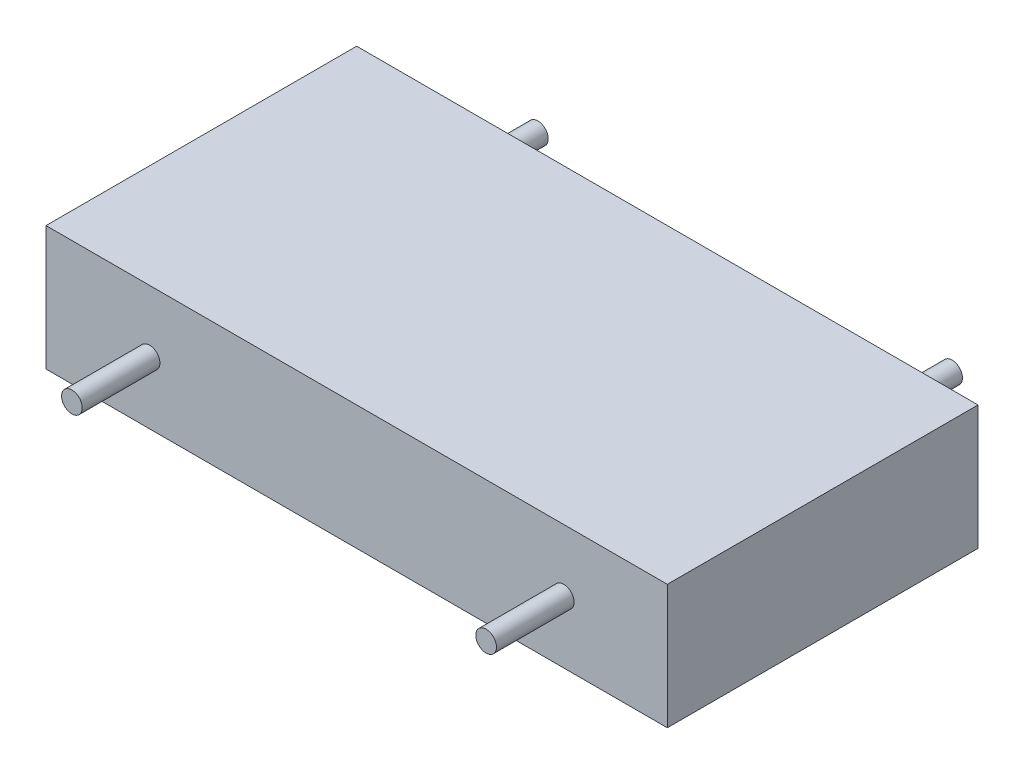
ISO-10303-21;
HEADER;
FILE_DESCRIPTION(('STEP AP214'),'2;1');
FILE_NAME('part.step','',(''),(''),'','','');
FILE_SCHEMA(('AUTOMOTIVE_DESIGN { 1 0 10303 214 1 1 1 1 }'));
ENDSEC;
DATA;
#1=APPLICATION_CONTEXT('core data for automotive mechanical design processes');
#2=APPLICATION_PROTOCOL_DEFINITION('international standard','automotive_design',2000,#1);
#3=PRODUCT_CONTEXT('',#1,'mechanical');
#4=PRODUCT('Part','Part','',(#3));
#5=PRODUCT_RELATED_PRODUCT_CATEGORY('part','',(#4));
#6=PRODUCT_DEFINITION_FORMATION('','',#4);
#7=PRODUCT_DEFINITION_CONTEXT('part definition',#1,'design');
#8=PRODUCT_DEFINITION('design','',#6,#7);
#9=PRODUCT_DEFINITION_SHAPE('','',#8);
#10=(LENGTH_UNIT() NAMED_UNIT(*) SI_UNIT(.MILLI.,.METRE.));
#11=(NAMED_UNIT(*) PLANE_ANGLE_UNIT() SI_UNIT($,.RADIAN.));
#12=(NAMED_UNIT(*) SI_UNIT($,.STERADIAN.) SOLID_ANGLE_UNIT());
#13=UNCERTAINTY_MEASURE_WITH_UNIT(LENGTH_MEASURE(1.E-05),#10,'distance_accuracy_value','');
#14=(GEOMETRIC_REPRESENTATION_CONTEXT(3) GLOBAL_UNCERTAINTY_ASSIGNED_CONTEXT((#13)) GLOBAL_UNIT_ASSIGNED_CONTEXT((#10,
#11,#12)) REPRESENTATION_CONTEXT('',''));
#15=CARTESIAN_POINT('',(0.,0.,0.));
#16=DIRECTION('',(0.,0.,1.));
#17=DIRECTION('',(1.,0.,0.));
#18=AXIS2_PLACEMENT_3D('',#15,#16,#17);
#19=CARTESIAN_POINT('',(300.,120.,150.));
#20=DIRECTION('',(-1.,0.,0.));
#21=DIRECTION('',(0.,0.,1.));
#22=AXIS2_PLACEMENT_3D('',#19,#20,#21);
#23=PLANE('',#22);
#24=DIRECTION('',(0.,0.,-1.));
#25=VECTOR('',#24,1.);
#26=CARTESIAN_POINT('',(300.,0.,150.));
#27=LINE('',#26,#25);
#28=CARTESIAN_POINT('',(300.,0.,150.));
#29=VERTEX_POINT('',#28);
#30=CARTESIAN_POINT('',(300.,0.,-150.));
#31=VERTEX_POINT('',#30);
#32=EDGE_CURVE('E117',#29,#31,#27,.T.);
#33=ORIENTED_EDGE('',*,*,#32,.T.);
#34=DIRECTION('',(0.,-1.,0.));
#35=VECTOR('',#34,1.);
#36=CARTESIAN_POINT('',(300.,120.,-150.));
#37=LINE('',#36,#35);
#38=CARTESIAN_POINT('',(300.,120.,-150.));
#39=VERTEX_POINT('',#38);
#40=EDGE_CURVE('E106',#39,#31,#37,.T.);
#41=ORIENTED_EDGE('',*,*,#40,.F.);
#42=DIRECTION('',(0.,0.,-1.));
#43=VECTOR('',#42,1.);
#44=CARTESIAN_POINT('',(300.,120.,150.));
#45=LINE('',#44,#43);
#46=CARTESIAN_POINT('',(300.,120.,150.));
#47=VERTEX_POINT('',#46);
#48=EDGE_CURVE('E98',#47,#39,#45,.T.);
#49=ORIENTED_EDGE('',*,*,#48,.F.);
#50=DIRECTION('',(0.,-1.,0.));
#51=VECTOR('',#50,1.);
#52=CARTESIAN_POINT('',(300.,120.,150.));
#53=LINE('',#52,#51);
#54=EDGE_CURVE('E113',#47,#29,#53,.T.);
#55=ORIENTED_EDGE('',*,*,#54,.T.);
#56=EDGE_LOOP('',(#33,#41,#49,#55));
#57=FACE_BOUND('',#56,.T.);
#58=ADVANCED_FACE('F45',(#57),#23,.F.);
#59=CARTESIAN_POINT('',(-300.,120.,-150.));
#60=DIRECTION('',(0.,0.,1.));
#61=DIRECTION('',(1.,0.,0.));
#62=AXIS2_PLACEMENT_3D('',#59,#60,#61);
#63=PLANE('',#62);
#64=CARTESIAN_POINT('',(-200.,60.,-150.));
#65=DIRECTION('',(0.,0.,1.));
#66=DIRECTION('',(1.,0.,0.));
#67=AXIS2_PLACEMENT_3D('',#64,#65,#66);
#68=CIRCLE('',#67,9.99999999999998);
#69=CARTESIAN_POINT('',(-190.,60.,-150.));
#70=VERTEX_POINT('',#69);
#71=EDGE_CURVE('E11',#70,#70,#68,.F.);
#72=ORIENTED_EDGE('',*,*,#71,.F.);
#73=EDGE_LOOP('',(#72));
#74=FACE_BOUND('',#73,.T.);
#75=CARTESIAN_POINT('',(200.,60.,-150.));
#76=DIRECTION('',(0.,0.,1.));
#77=DIRECTION('',(1.,0.,0.));
#78=AXIS2_PLACEMENT_3D('',#75,#76,#77);
#79=CIRCLE('',#78,10.);
#80=CARTESIAN_POINT('',(210.,60.,-150.));
#81=VERTEX_POINT('',#80);
#82=EDGE_CURVE('E54',#81,#81,#79,.F.);
#83=ORIENTED_EDGE('',*,*,#82,.F.);
#84=EDGE_LOOP('',(#83));
#85=FACE_BOUND('',#84,.T.);
#86=DIRECTION('',(-1.,0.,0.));
#87=VECTOR('',#86,1.);
#88=CARTESIAN_POINT('',(-300.,0.,-150.));
#89=LINE('',#88,#87);
#90=CARTESIAN_POINT('',(-300.,0.,-150.));
#91=VERTEX_POINT('',#90);
#92=EDGE_CURVE('E104',#31,#91,#89,.T.);
#93=ORIENTED_EDGE('',*,*,#92,.T.);
#94=DIRECTION('',(0.,-1.,0.));
#95=VECTOR('',#94,1.);
#96=CARTESIAN_POINT('',(-300.,120.,-150.));
#97=LINE('',#96,#95);
#98=CARTESIAN_POINT('',(-300.,120.,-150.));
#99=VERTEX_POINT('',#98);
#100=EDGE_CURVE('E102',#99,#91,#97,.T.);
#101=ORIENTED_EDGE('',*,*,#100,.F.);
#102=DIRECTION('',(-1.,0.,0.));
#103=VECTOR('',#102,1.);
#104=CARTESIAN_POINT('',(-300.,120.,-150.));
#105=LINE('',#104,#103);
#106=EDGE_CURVE('E93',#39,#99,#105,.T.);
#107=ORIENTED_EDGE('',*,*,#106,.F.);
#108=ORIENTED_EDGE('',*,*,#40,.T.);
#109=EDGE_LOOP('',(#93,#101,#107,#108));
#110=FACE_BOUND('',#109,.T.);
#111=ADVANCED_FACE('F103',(#74,#85,#110),#63,.F.);
#112=CARTESIAN_POINT('',(-300.,120.,150.));
#113=DIRECTION('',(1.,0.,0.));
#114=DIRECTION('',(0.,0.,-1.));
#115=AXIS2_PLACEMENT_3D('',#112,#113,#114);
#116=PLANE('',#115);
#117=DIRECTION('',(0.,0.,1.));
#118=VECTOR('',#117,1.);
#119=CARTESIAN_POINT('',(-300.,0.,150.));
#120=LINE('',#119,#118);
#121=CARTESIAN_POINT('',(-300.,0.,150.));
#122=VERTEX_POINT('',#121);
#123=EDGE_CURVE('E79',#91,#122,#120,.T.);
#124=ORIENTED_EDGE('',*,*,#123,.T.);
#125=DIRECTION('',(0.,-1.,0.));
#126=VECTOR('',#125,1.);
#127=CARTESIAN_POINT('',(-300.,120.,150.));
#128=LINE('',#127,#126);
#129=CARTESIAN_POINT('',(-300.,120.,150.));
#130=VERTEX_POINT('',#129);
#131=EDGE_CURVE('E107',#130,#122,#128,.T.);
#132=ORIENTED_EDGE('',*,*,#131,.F.);
#133=DIRECTION('',(0.,0.,1.));
#134=VECTOR('',#133,1.);
#135=CARTESIAN_POINT('',(-300.,120.,150.));
#136=LINE('',#135,#134);
#137=EDGE_CURVE('E96',#99,#130,#136,.T.);
#138=ORIENTED_EDGE('',*,*,#137,.F.);
#139=ORIENTED_EDGE('',*,*,#100,.T.);
#140=EDGE_LOOP('',(#124,#132,#138,#139));
#141=FACE_BOUND('',#140,.T.);
#142=ADVANCED_FACE('F109',(#141),#116,.F.);
#143=CARTESIAN_POINT('',(-300.,120.,150.));
#144=DIRECTION('',(0.,0.,-1.));
#145=DIRECTION('',(-1.,0.,0.));
#146=AXIS2_PLACEMENT_3D('',#143,#144,#145);
#147=PLANE('',#146);
#148=CARTESIAN_POINT('',(-200.,60.,150.));
#149=DIRECTION('',(0.,0.,-1.));
#150=DIRECTION('',(-1.,0.,0.));
#151=AXIS2_PLACEMENT_3D('',#148,#149,#150);
#152=CIRCLE('',#151,9.99999999999998);
#153=CARTESIAN_POINT('',(-210.,60.,150.));
#154=VERTEX_POINT('',#153);
#155=EDGE_CURVE('E138',#154,#154,#152,.F.);
#156=ORIENTED_EDGE('',*,*,#155,.F.);
#157=EDGE_LOOP('',(#156));
#158=FACE_BOUND('',#157,.T.);
#159=CARTESIAN_POINT('',(200.,60.,150.));
#160=DIRECTION('',(0.,0.,-1.));
#161=DIRECTION('',(-1.,0.,0.));
#162=AXIS2_PLACEMENT_3D('',#159,#160,#161);
#163=CIRCLE('',#162,10.);
#164=CARTESIAN_POINT('',(190.,60.,150.));
#165=VERTEX_POINT('',#164);
#166=EDGE_CURVE('E134',#165,#165,#163,.F.);
#167=ORIENTED_EDGE('',*,*,#166,.F.);
#168=EDGE_LOOP('',(#167));
#169=FACE_BOUND('',#168,.T.);
#170=DIRECTION('',(1.,0.,0.));
#171=VECTOR('',#170,1.);
#172=CARTESIAN_POINT('',(-300.,0.,150.));
#173=LINE('',#172,#171);
#174=EDGE_CURVE('E85',#122,#29,#173,.T.);
#175=ORIENTED_EDGE('',*,*,#174,.T.);
#176=ORIENTED_EDGE('',*,*,#54,.F.);
#177=DIRECTION('',(1.,0.,0.));
#178=VECTOR('',#177,1.);
#179=CARTESIAN_POINT('',(-300.,120.,150.));
#180=LINE('',#179,#178);
#181=EDGE_CURVE('E62',#130,#47,#180,.T.);
#182=ORIENTED_EDGE('',*,*,#181,.F.);
#183=ORIENTED_EDGE('',*,*,#131,.T.);
#184=EDGE_LOOP('',(#175,#176,#182,#183));
#185=FACE_BOUND('',#184,.T.);
#186=ADVANCED_FACE('F153',(#158,#169,#185),#147,.F.);
#187=CARTESIAN_POINT('',(0.,120.,0.));
#188=DIRECTION('',(0.,-1.,0.));
#189=DIRECTION('',(0.,0.,-1.));
#190=AXIS2_PLACEMENT_3D('',#187,#188,#189);
#191=PLANE('',#190);
#192=ORIENTED_EDGE('',*,*,#48,.T.);
#193=ORIENTED_EDGE('',*,*,#106,.T.);
#194=ORIENTED_EDGE('',*,*,#137,.T.);
#195=ORIENTED_EDGE('',*,*,#181,.T.);
#196=EDGE_LOOP('',(#192,#193,#194,#195));
#197=FACE_BOUND('',#196,.T.);
#198=ADVANCED_FACE('F94',(#197),#191,.F.);
#199=CARTESIAN_POINT('',(0.,0.,0.));
#200=DIRECTION('',(0.,-1.,0.));
#201=DIRECTION('',(0.,0.,-1.));
#202=AXIS2_PLACEMENT_3D('',#199,#200,#201);
#203=PLANE('',#202);
#204=ORIENTED_EDGE('',*,*,#32,.F.);
#205=ORIENTED_EDGE('',*,*,#174,.F.);
#206=ORIENTED_EDGE('',*,*,#123,.F.);
#207=ORIENTED_EDGE('',*,*,#92,.F.);
#208=EDGE_LOOP('',(#204,#205,#206,#207));
#209=FACE_BOUND('',#208,.T.);
#210=ADVANCED_FACE('F161',(#209),#203,.T.);
#211=CARTESIAN_POINT('',(200.,60.,225.));
#212=DIRECTION('',(0.,0.,-1.));
#213=DIRECTION('',(-1.,0.,0.));
#214=AXIS2_PLACEMENT_3D('',#211,#212,#213);
#215=CYLINDRICAL_SURFACE('',#214,10.);
#216=CARTESIAN_POINT('',(200.,60.,225.));
#217=DIRECTION('',(0.,0.,1.));
#218=DIRECTION('',(1.,0.,0.));
#219=AXIS2_PLACEMENT_3D('',#216,#217,#218);
#220=CIRCLE('',#219,10.);
#221=CARTESIAN_POINT('',(210.,60.,225.));
#222=VERTEX_POINT('',#221);
#223=EDGE_CURVE('E121',#222,#222,#220,.T.);
#224=ORIENTED_EDGE('',*,*,#223,.F.);
#225=EDGE_LOOP('',(#224));
#226=FACE_BOUND('',#225,.T.);
#227=ORIENTED_EDGE('',*,*,#166,.T.);
#228=EDGE_LOOP('',(#227));
#229=FACE_BOUND('',#228,.T.);
#230=ADVANCED_FACE('F164',(#226,#229),#215,.T.);
#231=CARTESIAN_POINT('',(200.,60.,225.));
#232=DIRECTION('',(0.,0.,1.));
#233=DIRECTION('',(1.,0.,0.));
#234=AXIS2_PLACEMENT_3D('',#231,#232,#233);
#235=PLANE('',#234);
#236=ORIENTED_EDGE('',*,*,#223,.T.);
#237=EDGE_LOOP('',(#236));
#238=FACE_BOUND('',#237,.T.);
#239=ADVANCED_FACE('F170',(#238),#235,.T.);
#240=CARTESIAN_POINT('',(-200.,60.,225.));
#241=DIRECTION('',(0.,0.,-1.));
#242=DIRECTION('',(-1.,0.,0.));
#243=AXIS2_PLACEMENT_3D('',#240,#241,#242);
#244=CYLINDRICAL_SURFACE('',#243,9.99999999999998);
#245=CARTESIAN_POINT('',(-200.,60.,225.));
#246=DIRECTION('',(0.,0.,1.));
#247=DIRECTION('',(1.,0.,0.));
#248=AXIS2_PLACEMENT_3D('',#245,#246,#247);
#249=CIRCLE('',#248,9.99999999999998);
#250=CARTESIAN_POINT('',(-190.,60.,225.));
#251=VERTEX_POINT('',#250);
#252=EDGE_CURVE('E208',#251,#251,#249,.T.);
#253=ORIENTED_EDGE('',*,*,#252,.F.);
#254=EDGE_LOOP('',(#253));
#255=FACE_BOUND('',#254,.T.);
#256=ORIENTED_EDGE('',*,*,#155,.T.);
#257=EDGE_LOOP('',(#256));
#258=FACE_BOUND('',#257,.T.);
#259=ADVANCED_FACE('F174',(#255,#258),#244,.T.);
#260=CARTESIAN_POINT('',(-200.,60.,225.));
#261=DIRECTION('',(0.,0.,1.));
#262=DIRECTION('',(1.,0.,0.));
#263=AXIS2_PLACEMENT_3D('',#260,#261,#262);
#264=PLANE('',#263);
#265=ORIENTED_EDGE('',*,*,#252,.T.);
#266=EDGE_LOOP('',(#265));
#267=FACE_BOUND('',#266,.T.);
#268=ADVANCED_FACE('F176',(#267),#264,.T.);
#269=CARTESIAN_POINT('',(200.,60.,-225.));
#270=DIRECTION('',(0.,0.,1.));
#271=DIRECTION('',(1.,0.,0.));
#272=AXIS2_PLACEMENT_3D('',#269,#270,#271);
#273=CYLINDRICAL_SURFACE('',#272,10.);
#274=CARTESIAN_POINT('',(200.,60.,-225.));
#275=DIRECTION('',(0.,0.,-1.));
#276=DIRECTION('',(-1.,0.,0.));
#277=AXIS2_PLACEMENT_3D('',#274,#275,#276);
#278=CIRCLE('',#277,10.);
#279=CARTESIAN_POINT('',(190.,60.,-225.));
#280=VERTEX_POINT('',#279);
#281=EDGE_CURVE('E204',#280,#280,#278,.T.);
#282=ORIENTED_EDGE('',*,*,#281,.F.);
#283=EDGE_LOOP('',(#282));
#284=FACE_BOUND('',#283,.T.);
#285=ORIENTED_EDGE('',*,*,#82,.T.);
#286=EDGE_LOOP('',(#285));
#287=FACE_BOUND('',#286,.T.);
#288=ADVANCED_FACE('F145',(#284,#287),#273,.T.);
#289=CARTESIAN_POINT('',(200.,60.,-225.));
#290=DIRECTION('',(0.,0.,-1.));
#291=DIRECTION('',(-1.,0.,0.));
#292=AXIS2_PLACEMENT_3D('',#289,#290,#291);
#293=PLANE('',#292);
#294=ORIENTED_EDGE('',*,*,#281,.T.);
#295=EDGE_LOOP('',(#294));
#296=FACE_BOUND('',#295,.T.);
#297=ADVANCED_FACE('F185',(#296),#293,.T.);
#298=CARTESIAN_POINT('',(-200.,60.,-225.));
#299=DIRECTION('',(0.,0.,1.));
#300=DIRECTION('',(1.,0.,0.));
#301=AXIS2_PLACEMENT_3D('',#298,#299,#300);
#302=CYLINDRICAL_SURFACE('',#301,9.99999999999998);
#303=CARTESIAN_POINT('',(-200.,60.,-225.));
#304=DIRECTION('',(0.,0.,-1.));
#305=DIRECTION('',(-1.,0.,0.));
#306=AXIS2_PLACEMENT_3D('',#303,#304,#305);
#307=CIRCLE('',#306,9.99999999999998);
#308=CARTESIAN_POINT('',(-210.,60.,-225.));
#309=VERTEX_POINT('',#308);
#310=EDGE_CURVE('E202',#309,#309,#307,.T.);
#311=ORIENTED_EDGE('',*,*,#310,.F.);
#312=EDGE_LOOP('',(#311));
#313=FACE_BOUND('',#312,.T.);
#314=ORIENTED_EDGE('',*,*,#71,.T.);
#315=EDGE_LOOP('',(#314));
#316=FACE_BOUND('',#315,.T.);
#317=ADVANCED_FACE('F189',(#313,#316),#302,.T.);
#318=CARTESIAN_POINT('',(-200.,60.,-225.));
#319=DIRECTION('',(0.,0.,-1.));
#320=DIRECTION('',(-1.,0.,0.));
#321=AXIS2_PLACEMENT_3D('',#318,#319,#320);
#322=PLANE('',#321);
#323=ORIENTED_EDGE('',*,*,#310,.T.);
#324=EDGE_LOOP('',(#323));
#325=FACE_BOUND('',#324,.T.);
#326=ADVANCED_FACE('F191',(#325),#322,.T.);
#327=CLOSED_SHELL('',(#58,#111,#142,#186,#198,#210,#230,#239,#259,#268,#288,#297,#317,#326));
#328=MANIFOLD_SOLID_BREP('B2',#327);
#329=ADVANCED_BREP_SHAPE_REPRESENTATION('',(#18,#328),#14);
#330=SHAPE_DEFINITION_REPRESENTATION(#9,#329);
ENDSEC;
END-ISO-10303-21;
